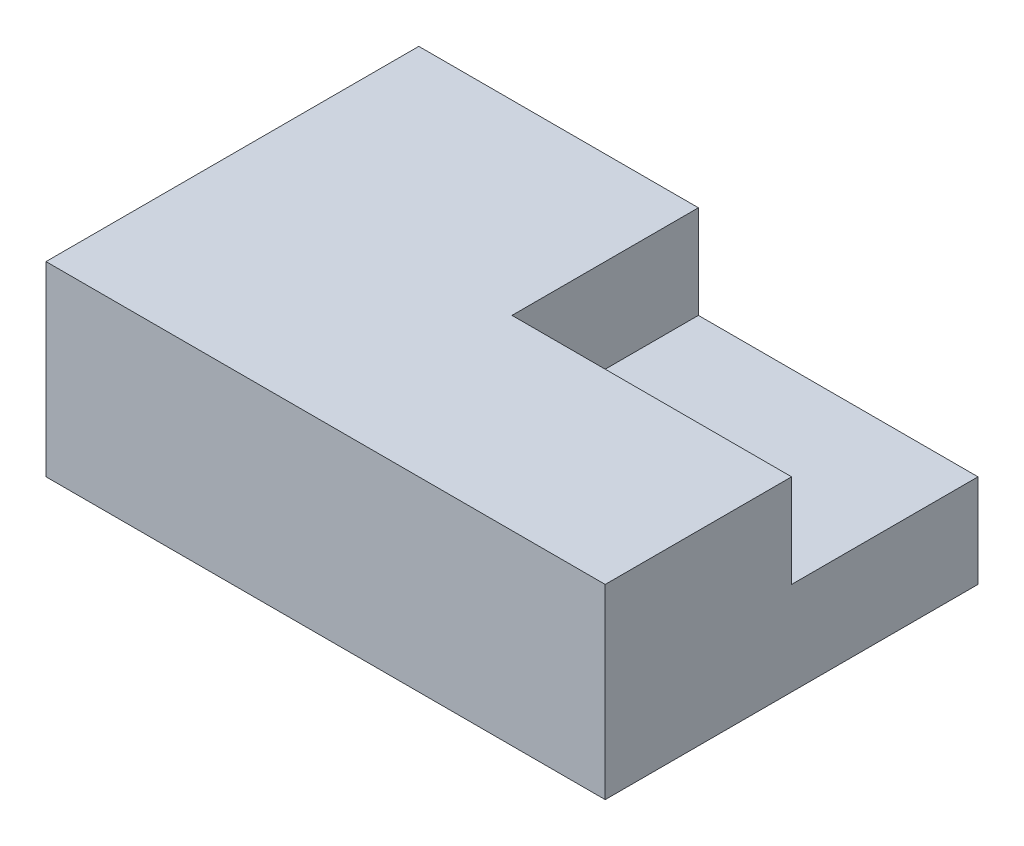
ISO-10303-21;
HEADER;
FILE_DESCRIPTION(('STEP AP214'),'2;1');
FILE_NAME('part.step','',(''),(''),'','','');
FILE_SCHEMA(('AUTOMOTIVE_DESIGN { 1 0 10303 214 1 1 1 1 }'));
ENDSEC;
DATA;
#1=APPLICATION_CONTEXT('core data for automotive mechanical design processes');
#2=APPLICATION_PROTOCOL_DEFINITION('international standard','automotive_design',2000,#1);
#3=PRODUCT_CONTEXT('',#1,'mechanical');
#4=PRODUCT('Part','Part','',(#3));
#5=PRODUCT_RELATED_PRODUCT_CATEGORY('part','',(#4));
#6=PRODUCT_DEFINITION_FORMATION('','',#4);
#7=PRODUCT_DEFINITION_CONTEXT('part definition',#1,'design');
#8=PRODUCT_DEFINITION('design','',#6,#7);
#9=PRODUCT_DEFINITION_SHAPE('','',#8);
#10=(LENGTH_UNIT() NAMED_UNIT(*) SI_UNIT(.MILLI.,.METRE.));
#11=(NAMED_UNIT(*) PLANE_ANGLE_UNIT() SI_UNIT($,.RADIAN.));
#12=(NAMED_UNIT(*) SI_UNIT($,.STERADIAN.) SOLID_ANGLE_UNIT());
#13=UNCERTAINTY_MEASURE_WITH_UNIT(LENGTH_MEASURE(1.E-05),#10,'distance_accuracy_value','');
#14=(GEOMETRIC_REPRESENTATION_CONTEXT(3) GLOBAL_UNCERTAINTY_ASSIGNED_CONTEXT((#13)) GLOBAL_UNIT_ASSIGNED_CONTEXT((#10,
#11,#12)) REPRESENTATION_CONTEXT('',''));
#15=CARTESIAN_POINT('',(0.,0.,0.));
#16=DIRECTION('',(0.,0.,1.));
#17=DIRECTION('',(1.,0.,0.));
#18=AXIS2_PLACEMENT_3D('',#15,#16,#17);
#19=CARTESIAN_POINT('',(15.,5.,-10.));
#20=DIRECTION('',(-1.,0.,0.));
#21=DIRECTION('',(0.,0.,1.));
#22=AXIS2_PLACEMENT_3D('',#19,#20,#21);
#23=PLANE('',#22);
#24=DIRECTION('',(0.,-1.,0.));
#25=VECTOR('',#24,1.);
#26=CARTESIAN_POINT('',(15.,5.,0.));
#27=LINE('',#26,#25);
#28=CARTESIAN_POINT('',(15.,5.,0.));
#29=VERTEX_POINT('',#28);
#30=CARTESIAN_POINT('',(15.,0.,0.));
#31=VERTEX_POINT('',#30);
#32=EDGE_CURVE('E192',#29,#31,#27,.T.);
#33=ORIENTED_EDGE('',*,*,#32,.F.);
#34=DIRECTION('',(0.,0.,-1.));
#35=VECTOR('',#34,1.);
#36=CARTESIAN_POINT('',(15.,5.,-10.));
#37=LINE('',#36,#35);
#38=CARTESIAN_POINT('',(15.,5.,10.));
#39=VERTEX_POINT('',#38);
#40=EDGE_CURVE('E124',#39,#29,#37,.T.);
#41=ORIENTED_EDGE('',*,*,#40,.F.);
#42=DIRECTION('',(0.,-1.,0.));
#43=VECTOR('',#42,1.);
#44=CARTESIAN_POINT('',(15.,5.,10.));
#45=LINE('',#44,#43);
#46=CARTESIAN_POINT('',(15.,-5.,10.));
#47=VERTEX_POINT('',#46);
#48=EDGE_CURVE('E130',#39,#47,#45,.T.);
#49=ORIENTED_EDGE('',*,*,#48,.T.);
#50=DIRECTION('',(0.,0.,-1.));
#51=VECTOR('',#50,1.);
#52=CARTESIAN_POINT('',(15.,-5.,-10.));
#53=LINE('',#52,#51);
#54=CARTESIAN_POINT('',(15.,-5.,-10.));
#55=VERTEX_POINT('',#54);
#56=EDGE_CURVE('E114',#47,#55,#53,.T.);
#57=ORIENTED_EDGE('',*,*,#56,.T.);
#58=DIRECTION('',(0.,-1.,0.));
#59=VECTOR('',#58,1.);
#60=CARTESIAN_POINT('',(15.,5.,-10.));
#61=LINE('',#60,#59);
#62=CARTESIAN_POINT('',(15.,0.,-10.));
#63=VERTEX_POINT('',#62);
#64=EDGE_CURVE('E11',#63,#55,#61,.T.);
#65=ORIENTED_EDGE('',*,*,#64,.F.);
#66=DIRECTION('',(0.,0.,-1.));
#67=VECTOR('',#66,1.);
#68=CARTESIAN_POINT('',(15.,0.,-10.));
#69=LINE('',#68,#67);
#70=EDGE_CURVE('E183',#31,#63,#69,.T.);
#71=ORIENTED_EDGE('',*,*,#70,.F.);
#72=EDGE_LOOP('',(#33,#41,#49,#57,#65,#71));
#73=FACE_BOUND('',#72,.T.);
#74=ADVANCED_FACE('F39',(#73),#23,.F.);
#75=CARTESIAN_POINT('',(-15.,5.,-10.));
#76=DIRECTION('',(0.,0.,1.));
#77=DIRECTION('',(1.,0.,0.));
#78=AXIS2_PLACEMENT_3D('',#75,#76,#77);
#79=PLANE('',#78);
#80=DIRECTION('',(0.,-1.,0.));
#81=VECTOR('',#80,1.);
#82=CARTESIAN_POINT('',(0.,5.,-10.));
#83=LINE('',#82,#81);
#84=CARTESIAN_POINT('',(0.,5.,-10.));
#85=VERTEX_POINT('',#84);
#86=CARTESIAN_POINT('',(0.,0.,-10.));
#87=VERTEX_POINT('',#86);
#88=EDGE_CURVE('E107',#85,#87,#83,.T.);
#89=ORIENTED_EDGE('',*,*,#88,.T.);
#90=DIRECTION('',(-1.,0.,0.));
#91=VECTOR('',#90,1.);
#92=CARTESIAN_POINT('',(15.,0.,-10.));
#93=LINE('',#92,#91);
#94=EDGE_CURVE('E184',#63,#87,#93,.T.);
#95=ORIENTED_EDGE('',*,*,#94,.F.);
#96=ORIENTED_EDGE('',*,*,#64,.T.);
#97=DIRECTION('',(-1.,0.,0.));
#98=VECTOR('',#97,1.);
#99=CARTESIAN_POINT('',(-15.,-5.,-10.));
#100=LINE('',#99,#98);
#101=CARTESIAN_POINT('',(-15.,-5.,-10.));
#102=VERTEX_POINT('',#101);
#103=EDGE_CURVE('E133',#55,#102,#100,.T.);
#104=ORIENTED_EDGE('',*,*,#103,.T.);
#105=DIRECTION('',(0.,-1.,0.));
#106=VECTOR('',#105,1.);
#107=CARTESIAN_POINT('',(-15.,5.,-10.));
#108=LINE('',#107,#106);
#109=CARTESIAN_POINT('',(-15.,5.,-10.));
#110=VERTEX_POINT('',#109);
#111=EDGE_CURVE('E46',#110,#102,#108,.T.);
#112=ORIENTED_EDGE('',*,*,#111,.F.);
#113=DIRECTION('',(-1.,0.,0.));
#114=VECTOR('',#113,1.);
#115=CARTESIAN_POINT('',(-15.,5.,-10.));
#116=LINE('',#115,#114);
#117=EDGE_CURVE('E86',#85,#110,#116,.T.);
#118=ORIENTED_EDGE('',*,*,#117,.F.);
#119=EDGE_LOOP('',(#89,#95,#96,#104,#112,#118));
#120=FACE_BOUND('',#119,.T.);
#121=ADVANCED_FACE('F120',(#120),#79,.F.);
#122=CARTESIAN_POINT('',(0.,5.,0.));
#123=DIRECTION('',(0.,1.,0.));
#124=DIRECTION('',(0.,0.,1.));
#125=AXIS2_PLACEMENT_3D('',#122,#123,#124);
#126=PLANE('',#125);
#127=DIRECTION('',(1.,0.,0.));
#128=VECTOR('',#127,1.);
#129=CARTESIAN_POINT('',(15.,5.,0.));
#130=LINE('',#129,#128);
#131=CARTESIAN_POINT('',(0.,5.,0.));
#132=VERTEX_POINT('',#131);
#133=EDGE_CURVE('E117',#132,#29,#130,.T.);
#134=ORIENTED_EDGE('',*,*,#133,.F.);
#135=DIRECTION('',(0.,0.,1.));
#136=VECTOR('',#135,1.);
#137=CARTESIAN_POINT('',(0.,5.,-10.));
#138=LINE('',#137,#136);
#139=EDGE_CURVE('E109',#85,#132,#138,.T.);
#140=ORIENTED_EDGE('',*,*,#139,.F.);
#141=ORIENTED_EDGE('',*,*,#117,.T.);
#142=DIRECTION('',(0.,0.,1.));
#143=VECTOR('',#142,1.);
#144=CARTESIAN_POINT('',(-15.,5.,-10.));
#145=LINE('',#144,#143);
#146=CARTESIAN_POINT('',(-15.,5.,10.));
#147=VERTEX_POINT('',#146);
#148=EDGE_CURVE('E123',#110,#147,#145,.T.);
#149=ORIENTED_EDGE('',*,*,#148,.T.);
#150=DIRECTION('',(1.,0.,0.));
#151=VECTOR('',#150,1.);
#152=CARTESIAN_POINT('',(-15.,5.,10.));
#153=LINE('',#152,#151);
#154=EDGE_CURVE('E62',#147,#39,#153,.T.);
#155=ORIENTED_EDGE('',*,*,#154,.T.);
#156=ORIENTED_EDGE('',*,*,#40,.T.);
#157=EDGE_LOOP('',(#134,#140,#141,#149,#155,#156));
#158=FACE_BOUND('',#157,.T.);
#159=ADVANCED_FACE('F116',(#158),#126,.T.);
#160=CARTESIAN_POINT('',(-15.,5.,-10.));
#161=DIRECTION('',(1.,0.,0.));
#162=DIRECTION('',(0.,0.,-1.));
#163=AXIS2_PLACEMENT_3D('',#160,#161,#162);
#164=PLANE('',#163);
#165=DIRECTION('',(0.,0.,1.));
#166=VECTOR('',#165,1.);
#167=CARTESIAN_POINT('',(-15.,-5.,-10.));
#168=LINE('',#167,#166);
#169=CARTESIAN_POINT('',(-15.,-5.,10.));
#170=VERTEX_POINT('',#169);
#171=EDGE_CURVE('E135',#102,#170,#168,.T.);
#172=ORIENTED_EDGE('',*,*,#171,.T.);
#173=DIRECTION('',(0.,-1.,0.));
#174=VECTOR('',#173,1.);
#175=CARTESIAN_POINT('',(-15.,5.,10.));
#176=LINE('',#175,#174);
#177=EDGE_CURVE('E139',#147,#170,#176,.T.);
#178=ORIENTED_EDGE('',*,*,#177,.F.);
#179=ORIENTED_EDGE('',*,*,#148,.F.);
#180=ORIENTED_EDGE('',*,*,#111,.T.);
#181=EDGE_LOOP('',(#172,#178,#179,#180));
#182=FACE_BOUND('',#181,.T.);
#183=ADVANCED_FACE('F142',(#182),#164,.F.);
#184=CARTESIAN_POINT('',(-15.,5.,10.));
#185=DIRECTION('',(0.,0.,-1.));
#186=DIRECTION('',(-1.,0.,0.));
#187=AXIS2_PLACEMENT_3D('',#184,#185,#186);
#188=PLANE('',#187);
#189=DIRECTION('',(1.,0.,0.));
#190=VECTOR('',#189,1.);
#191=CARTESIAN_POINT('',(-15.,-5.,10.));
#192=LINE('',#191,#190);
#193=EDGE_CURVE('E81',#170,#47,#192,.T.);
#194=ORIENTED_EDGE('',*,*,#193,.T.);
#195=ORIENTED_EDGE('',*,*,#48,.F.);
#196=ORIENTED_EDGE('',*,*,#154,.F.);
#197=ORIENTED_EDGE('',*,*,#177,.T.);
#198=EDGE_LOOP('',(#194,#195,#196,#197));
#199=FACE_BOUND('',#198,.T.);
#200=ADVANCED_FACE('F153',(#199),#188,.F.);
#201=CARTESIAN_POINT('',(0.,-5.,0.));
#202=DIRECTION('',(0.,1.,0.));
#203=DIRECTION('',(0.,0.,1.));
#204=AXIS2_PLACEMENT_3D('',#201,#202,#203);
#205=PLANE('',#204);
#206=ORIENTED_EDGE('',*,*,#56,.F.);
#207=ORIENTED_EDGE('',*,*,#193,.F.);
#208=ORIENTED_EDGE('',*,*,#171,.F.);
#209=ORIENTED_EDGE('',*,*,#103,.F.);
#210=EDGE_LOOP('',(#206,#207,#208,#209));
#211=FACE_BOUND('',#210,.T.);
#212=ADVANCED_FACE('F147',(#211),#205,.F.);
#213=CARTESIAN_POINT('',(0.,5.,-10.));
#214=DIRECTION('',(1.,0.,0.));
#215=DIRECTION('',(0.,0.,-1.));
#216=AXIS2_PLACEMENT_3D('',#213,#214,#215);
#217=PLANE('',#216);
#218=DIRECTION('',(0.,0.,1.));
#219=VECTOR('',#218,1.);
#220=CARTESIAN_POINT('',(0.,0.,-10.));
#221=LINE('',#220,#219);
#222=CARTESIAN_POINT('',(0.,0.,0.));
#223=VERTEX_POINT('',#222);
#224=EDGE_CURVE('E111',#87,#223,#221,.T.);
#225=ORIENTED_EDGE('',*,*,#224,.F.);
#226=ORIENTED_EDGE('',*,*,#88,.F.);
#227=ORIENTED_EDGE('',*,*,#139,.T.);
#228=DIRECTION('',(0.,-1.,0.));
#229=VECTOR('',#228,1.);
#230=CARTESIAN_POINT('',(0.,5.,0.));
#231=LINE('',#230,#229);
#232=EDGE_CURVE('E53',#132,#223,#231,.T.);
#233=ORIENTED_EDGE('',*,*,#232,.T.);
#234=EDGE_LOOP('',(#225,#226,#227,#233));
#235=FACE_BOUND('',#234,.T.);
#236=ADVANCED_FACE('F108',(#235),#217,.T.);
#237=CARTESIAN_POINT('',(15.,5.,0.));
#238=DIRECTION('',(0.,0.,-1.));
#239=DIRECTION('',(-1.,0.,0.));
#240=AXIS2_PLACEMENT_3D('',#237,#238,#239);
#241=PLANE('',#240);
#242=DIRECTION('',(1.,0.,0.));
#243=VECTOR('',#242,1.);
#244=CARTESIAN_POINT('',(15.,0.,0.));
#245=LINE('',#244,#243);
#246=EDGE_CURVE('E118',#223,#31,#245,.T.);
#247=ORIENTED_EDGE('',*,*,#246,.F.);
#248=ORIENTED_EDGE('',*,*,#232,.F.);
#249=ORIENTED_EDGE('',*,*,#133,.T.);
#250=ORIENTED_EDGE('',*,*,#32,.T.);
#251=EDGE_LOOP('',(#247,#248,#249,#250));
#252=FACE_BOUND('',#251,.T.);
#253=ADVANCED_FACE('F175',(#252),#241,.T.);
#254=CARTESIAN_POINT('',(0.,0.,0.));
#255=DIRECTION('',(0.,-1.,0.));
#256=DIRECTION('',(0.,0.,-1.));
#257=AXIS2_PLACEMENT_3D('',#254,#255,#256);
#258=PLANE('',#257);
#259=ORIENTED_EDGE('',*,*,#70,.T.);
#260=ORIENTED_EDGE('',*,*,#94,.T.);
#261=ORIENTED_EDGE('',*,*,#224,.T.);
#262=ORIENTED_EDGE('',*,*,#246,.T.);
#263=EDGE_LOOP('',(#259,#260,#261,#262));
#264=FACE_BOUND('',#263,.T.);
#265=ADVANCED_FACE('F178',(#264),#258,.F.);
#266=CLOSED_SHELL('',(#74,#121,#159,#183,#200,#212,#236,#253,#265));
#267=MANIFOLD_SOLID_BREP('B2',#266);
#268=ADVANCED_BREP_SHAPE_REPRESENTATION('',(#18,#267),#14);
#269=SHAPE_DEFINITION_REPRESENTATION(#9,#268);
ENDSEC;
END-ISO-10303-21;
